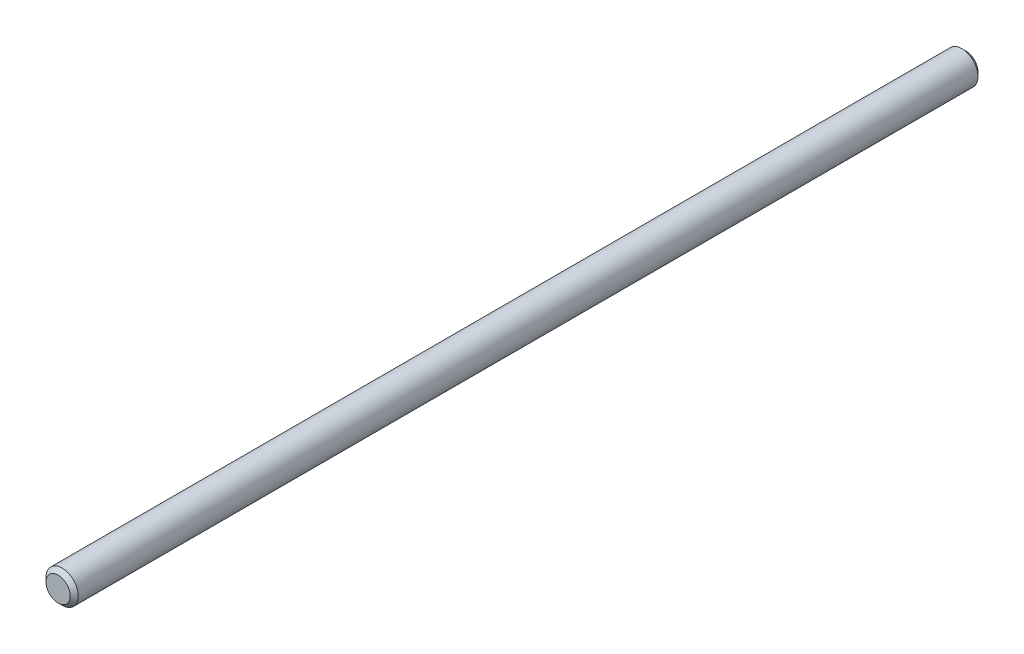
ISO-10303-21;
HEADER;
FILE_DESCRIPTION(('STEP AP214'),'2;1');
FILE_NAME('part.step','',(''),(''),'','','');
FILE_SCHEMA(('AUTOMOTIVE_DESIGN { 1 0 10303 214 1 1 1 1 }'));
ENDSEC;
DATA;
#1=APPLICATION_CONTEXT('core data for automotive mechanical design processes');
#2=APPLICATION_PROTOCOL_DEFINITION('international standard','automotive_design',2000,#1);
#3=PRODUCT_CONTEXT('',#1,'mechanical');
#4=PRODUCT('Part','Part','',(#3));
#5=PRODUCT_RELATED_PRODUCT_CATEGORY('part','',(#4));
#6=PRODUCT_DEFINITION_FORMATION('','',#4);
#7=PRODUCT_DEFINITION_CONTEXT('part definition',#1,'design');
#8=PRODUCT_DEFINITION('design','',#6,#7);
#9=PRODUCT_DEFINITION_SHAPE('','',#8);
#10=(LENGTH_UNIT() NAMED_UNIT(*) SI_UNIT(.MILLI.,.METRE.));
#11=(NAMED_UNIT(*) PLANE_ANGLE_UNIT() SI_UNIT($,.RADIAN.));
#12=(NAMED_UNIT(*) SI_UNIT($,.STERADIAN.) SOLID_ANGLE_UNIT());
#13=UNCERTAINTY_MEASURE_WITH_UNIT(LENGTH_MEASURE(1.E-05),#10,'distance_accuracy_value','');
#14=(GEOMETRIC_REPRESENTATION_CONTEXT(3) GLOBAL_UNCERTAINTY_ASSIGNED_CONTEXT((#13)) GLOBAL_UNIT_ASSIGNED_CONTEXT((#10,
#11,#12)) REPRESENTATION_CONTEXT('',''));
#15=CARTESIAN_POINT('',(0.,0.,0.));
#16=DIRECTION('',(0.,0.,1.));
#17=DIRECTION('',(1.,0.,0.));
#18=AXIS2_PLACEMENT_3D('',#15,#16,#17);
#19=CARTESIAN_POINT('',(0.,0.,225.));
#20=DIRECTION('',(0.,0.,-1.));
#21=DIRECTION('',(-1.,0.,0.));
#22=AXIS2_PLACEMENT_3D('',#19,#20,#21);
#23=CYLINDRICAL_SURFACE('',#22,4.);
#24=CARTESIAN_POINT('',(0.,0.,224.));
#25=DIRECTION('',(0.,0.,1.));
#26=DIRECTION('',(1.,0.,0.));
#27=AXIS2_PLACEMENT_3D('',#24,#25,#26);
#28=CIRCLE('',#27,4.);
#29=CARTESIAN_POINT('',(4.,0.,224.));
#30=VERTEX_POINT('',#29);
#31=EDGE_CURVE('E45',#30,#30,#28,.F.);
#32=ORIENTED_EDGE('',*,*,#31,.T.);
#33=EDGE_LOOP('',(#32));
#34=FACE_BOUND('',#33,.T.);
#35=CARTESIAN_POINT('',(0.,0.,0.999999999999973));
#36=DIRECTION('',(0.,0.,1.));
#37=DIRECTION('',(1.,0.,0.));
#38=AXIS2_PLACEMENT_3D('',#35,#36,#37);
#39=CIRCLE('',#38,4.);
#40=CARTESIAN_POINT('',(4.,0.,0.999999999999973));
#41=VERTEX_POINT('',#40);
#42=EDGE_CURVE('E49',#41,#41,#39,.T.);
#43=ORIENTED_EDGE('',*,*,#42,.T.);
#44=EDGE_LOOP('',(#43));
#45=FACE_BOUND('',#44,.T.);
#46=ADVANCED_FACE('F37',(#34,#45),#23,.T.);
#47=CARTESIAN_POINT('',(0.,0.,225.));
#48=DIRECTION('',(0.,0.,1.));
#49=DIRECTION('',(1.,0.,0.));
#50=AXIS2_PLACEMENT_3D('',#47,#48,#49);
#51=PLANE('',#50);
#52=CARTESIAN_POINT('',(0.,0.,225.));
#53=DIRECTION('',(0.,0.,1.));
#54=DIRECTION('',(1.,0.,0.));
#55=AXIS2_PLACEMENT_3D('',#52,#53,#54);
#56=CIRCLE('',#55,3.);
#57=CARTESIAN_POINT('',(3.,0.,225.));
#58=VERTEX_POINT('',#57);
#59=EDGE_CURVE('E53',#58,#58,#56,.T.);
#60=ORIENTED_EDGE('',*,*,#59,.T.);
#61=EDGE_LOOP('',(#60));
#62=FACE_BOUND('',#61,.T.);
#63=ADVANCED_FACE('F59',(#62),#51,.T.);
#64=CARTESIAN_POINT('',(0.,0.,0.));
#65=DIRECTION('',(0.,0.,1.));
#66=DIRECTION('',(1.,0.,0.));
#67=AXIS2_PLACEMENT_3D('',#64,#65,#66);
#68=PLANE('',#67);
#69=CARTESIAN_POINT('',(0.,0.,0.));
#70=DIRECTION('',(0.,0.,1.));
#71=DIRECTION('',(1.,0.,0.));
#72=AXIS2_PLACEMENT_3D('',#69,#70,#71);
#73=CIRCLE('',#72,3.00000000000003);
#74=CARTESIAN_POINT('',(3.00000000000003,0.,0.));
#75=VERTEX_POINT('',#74);
#76=EDGE_CURVE('E10',#75,#75,#73,.F.);
#77=ORIENTED_EDGE('',*,*,#76,.T.);
#78=EDGE_LOOP('',(#77));
#79=FACE_BOUND('',#78,.T.);
#80=ADVANCED_FACE('F63',(#79),#68,.F.);
#81=CARTESIAN_POINT('',(0.,0.,225.));
#82=DIRECTION('',(0.,0.,-1.));
#83=DIRECTION('',(-1.,0.,0.));
#84=AXIS2_PLACEMENT_3D('',#81,#82,#83);
#85=CONICAL_SURFACE('',#84,3.,0.78539816339746);
#86=ORIENTED_EDGE('',*,*,#31,.F.);
#87=EDGE_LOOP('',(#86));
#88=FACE_BOUND('',#87,.T.);
#89=ORIENTED_EDGE('',*,*,#59,.F.);
#90=EDGE_LOOP('',(#89));
#91=FACE_BOUND('',#90,.T.);
#92=ADVANCED_FACE('F61',(#88,#91),#85,.T.);
#93=CARTESIAN_POINT('',(0.,0.,0.999999999999973));
#94=DIRECTION('',(0.,0.,1.));
#95=DIRECTION('',(1.,0.,0.));
#96=AXIS2_PLACEMENT_3D('',#93,#94,#95);
#97=CONICAL_SURFACE('',#96,4.,0.785398163397447);
#98=ORIENTED_EDGE('',*,*,#76,.F.);
#99=EDGE_LOOP('',(#98));
#100=FACE_BOUND('',#99,.T.);
#101=ORIENTED_EDGE('',*,*,#42,.F.);
#102=EDGE_LOOP('',(#101));
#103=FACE_BOUND('',#102,.T.);
#104=ADVANCED_FACE('F40',(#100,#103),#97,.T.);
#105=CLOSED_SHELL('',(#46,#63,#80,#92,#104));
#106=MANIFOLD_SOLID_BREP('B2',#105);
#107=ADVANCED_BREP_SHAPE_REPRESENTATION('',(#18,#106),#14);
#108=SHAPE_DEFINITION_REPRESENTATION(#9,#107);
ENDSEC;
END-ISO-10303-21;
